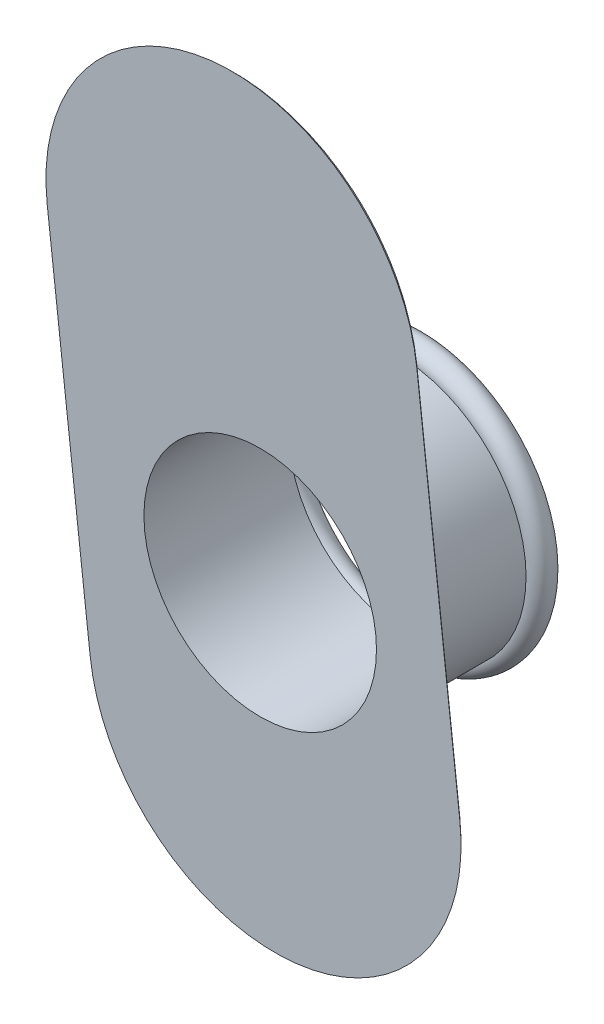
ISO-10303-21;
HEADER;
FILE_DESCRIPTION(('STEP AP214'),'2;1');
FILE_NAME('part.step','',(''),(''),'','','');
FILE_SCHEMA(('AUTOMOTIVE_DESIGN { 1 0 10303 214 1 1 1 1 }'));
ENDSEC;
DATA;
#1=APPLICATION_CONTEXT('core data for automotive mechanical design processes');
#2=APPLICATION_PROTOCOL_DEFINITION('international standard','automotive_design',2000,#1);
#3=PRODUCT_CONTEXT('',#1,'mechanical');
#4=PRODUCT('Part','Part','',(#3));
#5=PRODUCT_RELATED_PRODUCT_CATEGORY('part','',(#4));
#6=PRODUCT_DEFINITION_FORMATION('','',#4);
#7=PRODUCT_DEFINITION_CONTEXT('part definition',#1,'design');
#8=PRODUCT_DEFINITION('design','',#6,#7);
#9=PRODUCT_DEFINITION_SHAPE('','',#8);
#10=(LENGTH_UNIT() NAMED_UNIT(*) SI_UNIT(.MILLI.,.METRE.));
#11=(NAMED_UNIT(*) PLANE_ANGLE_UNIT() SI_UNIT($,.RADIAN.));
#12=(NAMED_UNIT(*) SI_UNIT($,.STERADIAN.) SOLID_ANGLE_UNIT());
#13=UNCERTAINTY_MEASURE_WITH_UNIT(LENGTH_MEASURE(1.E-05),#10,'distance_accuracy_value','');
#14=(GEOMETRIC_REPRESENTATION_CONTEXT(3) GLOBAL_UNCERTAINTY_ASSIGNED_CONTEXT((#13)) GLOBAL_UNIT_ASSIGNED_CONTEXT((#10,
#11,#12)) REPRESENTATION_CONTEXT('',''));
#15=CARTESIAN_POINT('',(0.,0.,0.));
#16=DIRECTION('',(0.,0.,1.));
#17=DIRECTION('',(1.,0.,0.));
#18=AXIS2_PLACEMENT_3D('',#15,#16,#17);
#19=CARTESIAN_POINT('',(550.233603989508,25.6899886030883,218.190394221551));
#20=DIRECTION('',(0.,0.,-1.));
#21=DIRECTION('',(0.993314481568456,0.115439770904089,0.));
#22=AXIS2_PLACEMENT_3D('',#19,#20,#21);
#23=PLANE('',#22);
#24=DIRECTION('',(0.115439770904089,-0.993314481568456,0.));
#25=VECTOR('',#24,1.);
#26=CARTESIAN_POINT('',(532.867618319303,55.887146853862,218.190394221551));
#27=LINE('',#26,#25);
#28=CARTESIAN_POINT('',(536.561690988234,24.1010834436714,218.190394221551));
#29=VERTEX_POINT('',#28);
#30=CARTESIAN_POINT('',(535.58739229226,32.4845460623654,218.190394221551));
#31=VERTEX_POINT('',#30);
#32=EDGE_CURVE('E137',#29,#31,#27,.F.);
#33=ORIENTED_EDGE('',*,*,#32,.T.);
#34=CARTESIAN_POINT('',(548.963766509563,36.6164479003413,218.190394221551));
#35=DIRECTION('',(0.,0.,-1.));
#36=DIRECTION('',(0.993314481568456,0.115439770904089,0.));
#37=AXIS2_PLACEMENT_3D('',#34,#35,#36);
#38=CIRCLE('',#37,14.);
#39=CARTESIAN_POINT('',(562.931218294806,35.6623563811991,218.190394221551));
#40=VERTEX_POINT('',#39);
#41=EDGE_CURVE('E61',#31,#40,#38,.F.);
#42=ORIENTED_EDGE('',*,*,#41,.T.);
#43=DIRECTION('',(-0.115439770904089,0.993314481568456,0.));
#44=VECTOR('',#43,1.);
#45=CARTESIAN_POINT('',(563.905516990781,27.2788937625052,218.190394221551));
#46=LINE('',#45,#44);
#47=CARTESIAN_POINT('',(563.905516990781,27.2788937625052,218.190394221551));
#48=VERTEX_POINT('',#47);
#49=EDGE_CURVE('E255',#40,#48,#46,.F.);
#50=ORIENTED_EDGE('',*,*,#49,.T.);
#51=CARTESIAN_POINT('',(550.233603989508,25.6899886030883,218.190394221551));
#52=DIRECTION('',(0.,0.,-1.));
#53=DIRECTION('',(0.993314481568456,0.115439770904089,0.));
#54=AXIS2_PLACEMENT_3D('',#51,#52,#53);
#55=CIRCLE('',#54,13.7639320225002);
#56=EDGE_CURVE('E254',#48,#29,#55,.T.);
#57=ORIENTED_EDGE('',*,*,#56,.T.);
#58=EDGE_LOOP('',(#33,#42,#50,#57));
#59=FACE_BOUND('',#58,.T.);
#60=ADVANCED_FACE('F40',(#59),#23,.T.);
#61=CARTESIAN_POINT('',(548.963766509563,36.6164479003413,218.190394221551));
#62=DIRECTION('',(0.,0.,1.));
#63=DIRECTION('',(-0.993314481568456,-0.115439770904089,0.));
#64=AXIS2_PLACEMENT_3D('',#61,#62,#63);
#65=CYLINDRICAL_SURFACE('',#64,10.);
#66=CARTESIAN_POINT('',(548.963766509563,36.6164479003413,219.190394221551));
#67=DIRECTION('',(0.,0.,-1.));
#68=DIRECTION('',(0.993314481568456,0.115439770904089,0.));
#69=AXIS2_PLACEMENT_3D('',#66,#67,#68);
#70=CIRCLE('',#69,10.);
#71=CARTESIAN_POINT('',(558.896911325247,37.7708456093822,219.190394221551));
#72=VERTEX_POINT('',#71);
#73=EDGE_CURVE('E133',#72,#72,#70,.T.);
#74=ORIENTED_EDGE('',*,*,#73,.F.);
#75=EDGE_LOOP('',(#74));
#76=FACE_BOUND('',#75,.T.);
#77=CARTESIAN_POINT('',(548.963766509563,36.6164479003413,206.732053398673));
#78=DIRECTION('',(0.,0.,-1.));
#79=DIRECTION('',(0.993314481568456,0.115439770904089,0.));
#80=AXIS2_PLACEMENT_3D('',#77,#78,#79);
#81=CIRCLE('',#80,10.);
#82=CARTESIAN_POINT('',(558.896911325247,37.7708456093822,206.732053398673));
#83=VERTEX_POINT('',#82);
#84=EDGE_CURVE('E138',#83,#83,#81,.T.);
#85=ORIENTED_EDGE('',*,*,#84,.T.);
#86=EDGE_LOOP('',(#85));
#87=FACE_BOUND('',#86,.T.);
#88=ADVANCED_FACE('F232',(#76,#87),#65,.F.);
#89=CARTESIAN_POINT('',(548.963766509563,36.6164479003413,206.190394221551));
#90=DIRECTION('',(0.,0.,1.));
#91=DIRECTION('',(-0.993314481568456,-0.115439770904089,0.));
#92=AXIS2_PLACEMENT_3D('',#89,#90,#91);
#93=CYLINDRICAL_SURFACE('',#92,11.);
#94=CARTESIAN_POINT('',(548.963766509563,36.6164479003413,215.190394221551));
#95=DIRECTION('',(0.,0.,-1.));
#96=DIRECTION('',(0.993314481568456,0.115439770904089,0.));
#97=AXIS2_PLACEMENT_3D('',#94,#95,#96);
#98=CIRCLE('',#97,11.);
#99=CARTESIAN_POINT('',(559.938192912254,35.8668045638724,215.190394221551));
#100=VERTEX_POINT('',#99);
#101=CARTESIAN_POINT('',(538.453758195967,33.3699535990745,215.190394221551));
#102=VERTEX_POINT('',#101);
#103=EDGE_CURVE('E146',#100,#102,#98,.T.);
#104=ORIENTED_EDGE('',*,*,#103,.T.);
#105=CARTESIAN_POINT('',(540.04342914329,30.1800217746185,215.391664177276));
#106=CARTESIAN_POINT('',(539.760051728266,30.572758690203,219.12908927664));
#107=CARTESIAN_POINT('',(536.845253177701,28.3356855724546,218.291029199413));
#108=CARTESIAN_POINT('',(539.95658067049,30.300379027302,215.36719947851));
#109=CARTESIAN_POINT('',(539.706971288824,30.6573693435221,219.064412279108));
#110=CARTESIAN_POINT('',(536.78046692411,28.4941842332649,218.278796849797));
#111=CARTESIAN_POINT('',(539.872011747135,30.4227263679187,215.345897676948));
#112=CARTESIAN_POINT('',(539.651258823226,30.7476072844706,219.002700311881));
#113=CARTESIAN_POINT('',(536.71700540641,28.6550325164166,218.268145949106));
#114=CARTESIAN_POINT('',(539.707707607653,30.6710700530625,215.308675936041));
#115=CARTESIAN_POINT('',(539.537300067266,30.9372911880108,218.886431613447));
#116=CARTESIAN_POINT('',(536.592933088401,28.9809896061933,218.249535078977));
#117=CARTESIAN_POINT('',(539.627971030477,30.7970653552125,215.292754475464));
#118=CARTESIAN_POINT('',(539.479048488402,31.0366751673318,218.83173132647));
#119=CARTESIAN_POINT('',(536.532321486489,29.1460971943129,218.241574348924));
#120=CARTESIAN_POINT('',(539.396571354458,31.179763970179,215.251667203368));
#121=CARTESIAN_POINT('',(539.304386686291,31.3453047461794,218.679358539395));
#122=CARTESIAN_POINT('',(536.355179059829,29.64680808191,218.221030713054));
#123=CARTESIAN_POINT('',(539.252467537794,31.4415272718515,215.233113730465));
#124=CARTESIAN_POINT('',(539.185402012433,31.5691710283717,218.590462996518));
#125=CARTESIAN_POINT('',(536.243153563231,29.9882568517755,218.211753976019));
#126=CARTESIAN_POINT('',(538.986080152425,31.9758778805373,215.207280095995));
#127=CARTESIAN_POINT('',(538.955672407188,32.0436114571011,218.43841970911));
#128=CARTESIAN_POINT('',(536.032383392871,30.6832463708016,218.198837158762));
#129=CARTESIAN_POINT('',(538.863778049485,32.2484557504125,215.199990318029));
#130=CARTESIAN_POINT('',(538.844282963351,32.2945672027593,218.374404721179));
#131=CARTESIAN_POINT('',(535.933627456052,31.0367765415435,218.195192270339));
#132=CARTESIAN_POINT('',(538.641688338013,32.8028024082058,215.191548724722));
#133=CARTESIAN_POINT('',(538.637063913993,32.8168539064131,218.267868251162));
#134=CARTESIAN_POINT('',(535.749963253679,31.7538135776285,218.19097147378));
#135=CARTESIAN_POINT('',(538.5419097344,33.0845748207646,215.190399360177));
#136=CARTESIAN_POINT('',(538.540519339762,33.0890474607261,218.224766463698));
#137=CARTESIAN_POINT('',(535.665060530401,32.1173243683185,218.190396791042));
#138=CARTESIAN_POINT('',(538.354256996814,33.6920753811775,215.190388421319));
#139=CARTESIAN_POINT('',(538.357006083178,33.6832074497276,218.152063848027));
#140=CARTESIAN_POINT('',(535.499724136165,32.8990481750095,218.190391321235));
#141=CARTESIAN_POINT('',(538.269569613606,34.018791963227,215.191840456912));
#142=CARTESIAN_POINT('',(538.271848452934,34.0091630852108,218.124364561907));
#143=CARTESIAN_POINT('',(535.421273295844,33.3182782769156,218.191117339198));
#144=CARTESIAN_POINT('',(538.130554905365,34.6786123241293,215.194166259699));
#145=CARTESIAN_POINT('',(538.131979581218,34.6706703407731,218.088071117173));
#146=CARTESIAN_POINT('',(535.283483040414,34.162598084396,218.192280240692));
#147=CARTESIAN_POINT('',(538.076227539152,35.0117160943179,215.195040027677));
#148=CARTESIAN_POINT('',(538.076628879413,35.0082627169389,218.079239277351));
#149=CARTESIAN_POINT('',(535.224143599382,34.5876877820218,218.192717124614));
#150=CARTESIAN_POINT('',(537.998386885468,35.6815047464747,215.195040027677));
#151=CARTESIAN_POINT('',(537.997985545206,35.6849581238538,218.079239277352));
#152=CARTESIAN_POINT('',(535.125073676512,35.4401460665867,218.192717124614));
#153=CARTESIAN_POINT('',(537.974873597997,36.0181896284428,215.194166259699));
#154=CARTESIAN_POINT('',(537.974438919784,36.0262466660974,218.088071117173));
#155=CARTESIAN_POINT('',(535.085343194672,35.8675146535258,218.192280240692));
#156=CARTESIAN_POINT('',(537.95886263425,36.6923050835456,215.191840456912));
#157=CARTESIAN_POINT('',(537.958872488105,36.7021999460226,218.124364561907));
#158=CARTESIAN_POINT('',(535.025828049392,36.7209313391359,218.191117339198));
#159=CARTESIAN_POINT('',(537.966365000043,37.0297356576912,215.190388421319));
#160=CARTESIAN_POINT('',(537.967007080026,37.0389976994389,218.152063848027));
#161=CARTESIAN_POINT('',(535.006043413005,37.146979436015,218.190391321235));
#162=CARTESIAN_POINT('',(538.009694545107,37.6640802260056,215.190399360177));
#163=CARTESIAN_POINT('',(538.009366945539,37.659407926358,218.224766463698));
#164=CARTESIAN_POINT('',(534.987695744027,37.9457857931813,218.190396791042));
#165=CARTESIAN_POINT('',(538.042193225528,37.9612254732991,215.191548724722));
#166=CARTESIAN_POINT('',(538.040914569094,37.946487938325,218.267868251162));
#167=CARTESIAN_POINT('',(534.986969474148,38.3190792968753,218.19097147378));
#168=CARTESIAN_POINT('',(538.13123200979,38.5517304706069,215.199990318029));
#169=CARTESIAN_POINT('',(538.122831535659,38.502377087184,218.374404721179));
#170=CARTESIAN_POINT('',(535.001296132808,39.0591261853916,218.195192270339));
#171=CARTESIAN_POINT('',(538.187762517457,38.8450916835036,215.207280095995));
#172=CARTESIAN_POINT('',(538.173698967164,38.7721897979471,218.43841970911));
#173=CARTESIAN_POINT('',(535.016342766564,39.4258821198963,218.198837158762));
#174=CARTESIAN_POINT('',(538.324504137591,39.4262926310333,215.233113730465));
#175=CARTESIAN_POINT('',(538.288499395884,39.2866703840772,218.590462996518));
#176=CARTESIAN_POINT('',(535.062109235684,40.1506854908693,218.211753976019));
#177=CARTESIAN_POINT('',(538.404735454582,39.7141274306206,215.251667203368));
#178=CARTESIAN_POINT('',(538.35297221315,39.5318574978278,218.679358539395));
#179=CARTESIAN_POINT('',(535.092842459929,40.5087252138865,218.221030713054));
#180=CARTESIAN_POINT('',(538.542201142113,40.1396943756606,215.292754475464));
#181=CARTESIAN_POINT('',(538.452198939153,39.8723175085532,218.83173132647));
#182=CARTESIAN_POINT('',(535.150432537626,41.0367159479266,218.241574348924));
#183=CARTESIAN_POINT('',(538.590917268048,40.2806180322184,215.308675936041));
#184=CARTESIAN_POINT('',(538.48610563372,39.9824118219821,218.886431613447));
#185=CARTESIAN_POINT('',(535.171563565252,41.2113233979751,218.249535078977));
#186=CARTESIAN_POINT('',(538.693888116162,40.5600235451206,215.345897676948));
#187=CARTESIAN_POINT('',(538.553525737007,40.1931749852601,219.002700311881));
#188=CARTESIAN_POINT('',(535.217575330641,41.5570471054606,218.268145949106));
#189=CARTESIAN_POINT('',(538.748144402171,40.6985046990079,215.36719947851));
#190=CARTESIAN_POINT('',(538.587058508272,40.2937847167029,219.064412279108));
#191=CARTESIAN_POINT('',(535.242457128089,41.7281623607051,218.278796849797));
#192=CARTESIAN_POINT('',(538.805075880311,40.835571588876,215.391664177276));
#193=CARTESIAN_POINT('',(538.619319943527,40.3883135244899,219.12908927664));
#194=CARTESIAN_POINT('',(535.269167206636,41.8972944269642,218.291029199413));
#195=(BOUNDED_SURFACE() B_SPLINE_SURFACE(3,2,((#105,#106,#107),(#108,#109,#110),(#111,#112,
#113),(#114,#115,#116),(#117,#118,#119),(#120,#121,#122),(#123,#124,#125),(#126,#127,#128),
(#129,#130,#131),(#132,#133,#134),(#135,#136,#137),(#138,#139,#140),(#141,#142,#143),(#144,#145,
#146),(#147,#148,#149),(#150,#151,#152),(#153,#154,#155),(#156,#157,#158),(#159,#160,#161),
(#162,#163,#164),(#165,#166,#167),(#168,#169,#170),(#171,#172,#173),(#174,#175,#176),(#177,#178,
#179),(#180,#181,#182),(#183,#184,#185),(#186,#187,#188),(#189,#190,#191),(#192,#193,#194)),
.UNSPECIFIED.,.F.,.F.,.F.) B_SPLINE_SURFACE_WITH_KNOTS((4,2,2,2,2,2,2,2,2,2,2,2,2,2,4),(3,3),
(0.,0.571273603242985,1.14238554983954,2.28296922852472,3.42257859279195,4.56264277028438,
5.84949215250036,7.13633978925784,8.42318742601531,9.71003680823128,10.8501009857237,
11.9897103499909,13.1302940286761,13.7014059752726,14.2726795785157),(0.,1.),
.UNSPECIFIED.) GEOMETRIC_REPRESENTATION_ITEM() RATIONAL_B_SPLINE_SURFACE(((1.,0.622802290166438,
1.),(1.,0.627504801588546,1.),(1.,0.632112426602754,1.),(1.,0.641090187858932,1.),(1.,
0.645460390935537,1.),(1.,0.658135118551086,1.),(1.,0.666017528344806,1.),(1.,0.680369299730215,
1.),(1.,0.68683986263038,1.),(1.,0.698195419001859,1.),(1.,0.70307977864858,1.),(1.,
0.711652267160473,1.),(1.,0.715105411239732,1.),(1.,0.719720787123328,1.),(1.,0.720883022035008,
1.),(1.,0.720883022035002,1.),(1.,0.719720787123314,1.),(1.,0.71510541123972,1.),(1.,
0.71165226716047,1.),(1.,0.703079778648582,1.),(1.,0.69819541900186,1.),(1.,0.686839862630378,
1.),(1.,0.680369299730213,1.),(1.,0.666017528344809,1.),(1.,0.658135118551094,1.),(1.,
0.645460390935534,1.),(1.,0.641090187858922,1.),(1.,0.632112426602739,1.),(1.,0.627504801588533,
1.),(1.,0.622802290166439,1.))) REPRESENTATION_ITEM('') SURFACE());
#196=CARTESIAN_POINT('',(540.04342914329,30.1800217746185,215.391664177276));
#197=CARTESIAN_POINT('',(539.95658067049,30.300379027302,215.36719947851));
#198=CARTESIAN_POINT('',(539.872011747135,30.4227263679187,215.345897676948));
#199=CARTESIAN_POINT('',(539.707707607653,30.6710700530625,215.308675936041));
#200=CARTESIAN_POINT('',(539.627971030477,30.7970653552125,215.292754475464));
#201=CARTESIAN_POINT('',(539.396571354458,31.179763970179,215.251667203368));
#202=CARTESIAN_POINT('',(539.252467537794,31.4415272718515,215.233113730465));
#203=CARTESIAN_POINT('',(538.986080152425,31.9758778805373,215.207280095995));
#204=CARTESIAN_POINT('',(538.863778049485,32.2484557504125,215.199990318029));
#205=CARTESIAN_POINT('',(538.641688338013,32.8028024082058,215.191548724722));
#206=CARTESIAN_POINT('',(538.541909734399,33.0845748207646,215.190399360177));
#207=CARTESIAN_POINT('',(538.354256996814,33.6920753811775,215.190388421319));
#208=CARTESIAN_POINT('',(538.269569613606,34.018791963227,215.191840456912));
#209=CARTESIAN_POINT('',(538.130554905365,34.6786123241293,215.194166259699));
#210=CARTESIAN_POINT('',(538.076227539152,35.0117160943179,215.195040027677));
#211=CARTESIAN_POINT('',(537.998386885468,35.6815047464747,215.195040027677));
#212=CARTESIAN_POINT('',(537.974873597997,36.0181896284428,215.194166259699));
#213=CARTESIAN_POINT('',(537.95886263425,36.6923050835456,215.191840456912));
#214=CARTESIAN_POINT('',(537.966365000043,37.0297356576912,215.190388421319));
#215=CARTESIAN_POINT('',(538.009694545107,37.6640802260056,215.190399360177));
#216=CARTESIAN_POINT('',(538.042193225528,37.9612254732991,215.191548724722));
#217=CARTESIAN_POINT('',(538.13123200979,38.5517304706069,215.199990318029));
#218=CARTESIAN_POINT('',(538.187762517457,38.8450916835036,215.207280095995));
#219=CARTESIAN_POINT('',(538.324504137591,39.4262926310333,215.233113730465));
#220=CARTESIAN_POINT('',(538.404735454582,39.7141274306206,215.251667203368));
#221=CARTESIAN_POINT('',(538.542201142113,40.1396943756606,215.292754475464));
#222=CARTESIAN_POINT('',(538.590917268048,40.2806180322184,215.308675936041));
#223=CARTESIAN_POINT('',(538.693888116162,40.5600235451206,215.345897676948));
#224=CARTESIAN_POINT('',(538.748144402171,40.6985046990079,215.36719947851));
#225=CARTESIAN_POINT('',(538.805075880311,40.835571588876,215.391664177276));
#226=B_SPLINE_CURVE_WITH_KNOTS('',3,(#196,#197,#198,#199,#200,#201,#202,#203,#204,#205,#206,
#207,#208,#209,#210,#211,#212,#213,#214,#215,#216,#217,#218,#219,#220,#221,#222,#223,#224,#225),
.UNSPECIFIED.,.F.,.F.,(4,2,2,2,2,2,2,2,2,2,2,2,2,2,4),(0.,0.571273603242985,1.14238554983954,
2.28296922852472,3.42257859279195,4.56264277028438,5.84949215250036,7.13633978925784,
8.42318742601531,9.71003680823128,10.8501009857237,11.9897103499909,13.1302940286761,
13.7014059752726,14.2726795785157),.UNSPECIFIED.);
#227=CARTESIAN_POINT('',(537.989340106871,37.3660912368102,215.190394221551));
#228=VERTEX_POINT('',#227);
#229=EDGE_CURVE('E264',#102,#228,#226,.T.);
#230=ORIENTED_EDGE('',*,*,#229,.T.);
#231=CARTESIAN_POINT('',(548.963766509563,36.6164479003413,215.190394221551));
#232=DIRECTION('',(0.,0.,-1.));
#233=DIRECTION('',(0.993314481568456,0.115439770904089,0.));
#234=AXIS2_PLACEMENT_3D('',#231,#232,#233);
#235=CIRCLE('',#234,11.);
#236=CARTESIAN_POINT('',(559.473774823158,39.8629422016081,215.190394221551));
#237=VERTEX_POINT('',#236);
#238=EDGE_CURVE('E157',#228,#237,#235,.T.);
#239=ORIENTED_EDGE('',*,*,#238,.T.);
#240=CARTESIAN_POINT('',(557.884103875835,43.0528740260641,215.391664177276));
#241=CARTESIAN_POINT('',(558.16748129086,42.6601371104796,219.12908927664));
#242=CARTESIAN_POINT('',(561.082279841425,44.897210228228,218.291029199413));
#243=CARTESIAN_POINT('',(557.970952348636,42.9325167733806,215.36719947851));
#244=CARTESIAN_POINT('',(558.220561730301,42.5755264571605,219.064412279108));
#245=CARTESIAN_POINT('',(561.147066095016,44.7387115674178,218.278796849797));
#246=CARTESIAN_POINT('',(558.055521271991,42.810169432764,215.345897676948));
#247=CARTESIAN_POINT('',(558.276274195899,42.485288516212,219.002700311881));
#248=CARTESIAN_POINT('',(561.210527612716,44.577863284266,218.268145949106));
#249=CARTESIAN_POINT('',(558.219825411472,42.5618257476202,215.308675936041));
#250=CARTESIAN_POINT('',(558.390232951859,42.2956046126718,218.886431613447));
#251=CARTESIAN_POINT('',(561.334599930725,44.2519061944893,218.249535078977));
#252=CARTESIAN_POINT('',(558.299561988649,42.4358304454701,215.292754475464));
#253=CARTESIAN_POINT('',(558.448484530724,42.1962206333508,218.83173132647));
#254=CARTESIAN_POINT('',(561.395211532636,44.0867986063697,218.241574348924));
#255=CARTESIAN_POINT('',(558.530961664668,42.0531318305037,215.251667203368));
#256=CARTESIAN_POINT('',(558.623146332835,41.8875910545031,218.679358539395));
#257=CARTESIAN_POINT('',(561.572353959296,43.5860877187726,218.221030713054));
#258=CARTESIAN_POINT('',(558.675065481332,41.7913685288311,215.233113730465));
#259=CARTESIAN_POINT('',(558.742131006692,41.6637247723109,218.590462996518));
#260=CARTESIAN_POINT('',(561.684379455895,43.2446389489072,218.211753976019));
#261=CARTESIAN_POINT('',(558.9414528667,41.2570179201453,215.207280095995));
#262=CARTESIAN_POINT('',(558.971860611937,41.1892843435815,218.43841970911));
#263=CARTESIAN_POINT('',(561.895149626254,42.549649429881,218.198837158762));
#264=CARTESIAN_POINT('',(559.063754969641,40.9844400502701,215.199990318029));
#265=CARTESIAN_POINT('',(559.083250055775,40.9383285979233,218.374404721179));
#266=CARTESIAN_POINT('',(561.993905563073,42.1961192591391,218.195192270339));
#267=CARTESIAN_POINT('',(559.285844681113,40.4300933924768,215.191548724722));
#268=CARTESIAN_POINT('',(559.290469105133,40.4160418942695,218.267868251162));
#269=CARTESIAN_POINT('',(562.177569765446,41.4790822230541,218.19097147378));
#270=CARTESIAN_POINT('',(559.385623284726,40.148320979918,215.190399360177));
#271=CARTESIAN_POINT('',(559.387013679364,40.1438483399565,218.224766463698));
#272=CARTESIAN_POINT('',(562.262472488725,41.1155714323641,218.190396791042));
#273=CARTESIAN_POINT('',(559.573276022312,39.5408204195051,215.190388421319));
#274=CARTESIAN_POINT('',(559.570526935947,39.549688350955,218.152063848027));
#275=CARTESIAN_POINT('',(562.42780888296,40.3338476256731,218.190391321235));
#276=CARTESIAN_POINT('',(559.657963405519,39.2141038374556,215.191840456912));
#277=CARTESIAN_POINT('',(559.655684566191,39.2237327154718,218.124364561907));
#278=CARTESIAN_POINT('',(562.506259723281,39.9146175237671,218.191117339198));
#279=CARTESIAN_POINT('',(559.796978113761,38.5542834765534,215.194166259699));
#280=CARTESIAN_POINT('',(559.795553437907,38.5622254599095,218.088071117173));
#281=CARTESIAN_POINT('',(562.644049978712,39.0702977162866,218.192280240692));
#282=CARTESIAN_POINT('',(559.851305479974,38.2211797063647,215.195040027677));
#283=CARTESIAN_POINT('',(559.850904139712,38.2246330837438,218.079239277351));
#284=CARTESIAN_POINT('',(562.703389419743,38.6452080186608,218.192717124614));
#285=CARTESIAN_POINT('',(559.929146133658,37.5513910542079,215.195040027677));
#286=CARTESIAN_POINT('',(559.929547473919,37.5479376768288,218.079239277351));
#287=CARTESIAN_POINT('',(562.802459342614,37.7927497340959,218.192717124614));
#288=CARTESIAN_POINT('',(559.952659421129,37.2147061722398,215.194166259699));
#289=CARTESIAN_POINT('',(559.953094099341,37.2066491345852,218.088071117173));
#290=CARTESIAN_POINT('',(562.842189824453,37.3653811471569,218.192280240692));
#291=CARTESIAN_POINT('',(559.968670384875,36.540590717137,215.191840456912));
#292=CARTESIAN_POINT('',(559.968660531021,36.5306958546601,218.124364561907));
#293=CARTESIAN_POINT('',(562.901704969734,36.5119644615468,218.191117339198));
#294=CARTESIAN_POINT('',(559.961168019082,36.2031601429915,215.190388421319));
#295=CARTESIAN_POINT('',(559.9605259391,36.1938981012438,218.152063848027));
#296=CARTESIAN_POINT('',(562.921489606121,36.0859163646676,218.190391321235));
#297=CARTESIAN_POINT('',(559.917838474018,35.568815574677,215.190399360177));
#298=CARTESIAN_POINT('',(559.918166073587,35.5734878743246,218.224766463698));
#299=CARTESIAN_POINT('',(562.939837275098,35.2871100075014,218.190396791042));
#300=CARTESIAN_POINT('',(559.885339793598,35.2716703273836,215.191548724722));
#301=CARTESIAN_POINT('',(559.886618450032,35.2864078623576,218.267868251162));
#302=CARTESIAN_POINT('',(562.940563544977,34.9138165038074,218.19097147378));
#303=CARTESIAN_POINT('',(559.796301009336,34.6811653300758,215.199990318029));
#304=CARTESIAN_POINT('',(559.804701483466,34.7305187134987,218.374404721179));
#305=CARTESIAN_POINT('',(562.926236886317,34.1737696152911,218.195192270339));
#306=CARTESIAN_POINT('',(559.739770501669,34.3878041171791,215.207280095995));
#307=CARTESIAN_POINT('',(559.753834051961,34.4607060027356,218.43841970911));
#308=CARTESIAN_POINT('',(562.911190252562,33.8070136807864,218.198837158762));
#309=CARTESIAN_POINT('',(559.603028881535,33.8066031696494,215.233113730465));
#310=CARTESIAN_POINT('',(559.639033623242,33.9462254166055,218.590462996518));
#311=CARTESIAN_POINT('',(562.865423783441,33.0822103098134,218.211753976019));
#312=CARTESIAN_POINT('',(559.522797564543,33.518768370062,215.251667203368));
#313=CARTESIAN_POINT('',(559.574560805975,33.7010383028549,218.679358539395));
#314=CARTESIAN_POINT('',(562.834690559196,32.7241705867961,218.221030713054));
#315=CARTESIAN_POINT('',(559.385331877012,33.0932014250221,215.292754475464));
#316=CARTESIAN_POINT('',(559.475334079973,33.3605782921295,218.83173132647));
#317=CARTESIAN_POINT('',(562.777100481499,32.196179852756,218.241574348924));
#318=CARTESIAN_POINT('',(559.336615751077,32.9522777684642,215.308675936041));
#319=CARTESIAN_POINT('',(559.441427385405,33.2504839787005,218.886431613447));
#320=CARTESIAN_POINT('',(562.755969453873,32.0215724027076,218.249535078977));
#321=CARTESIAN_POINT('',(559.233644902963,32.672872255562,215.345897676948));
#322=CARTESIAN_POINT('',(559.374007282118,33.0397208154225,219.002700311881));
#323=CARTESIAN_POINT('',(562.709957688485,31.675848695222,218.268145949106));
#324=CARTESIAN_POINT('',(559.179388616954,32.5343911016747,215.36719947851));
#325=CARTESIAN_POINT('',(559.340474510854,32.9391110839797,219.064412279108));
#326=CARTESIAN_POINT('',(562.685075891036,31.5047334399775,218.278796849797));
#327=CARTESIAN_POINT('',(559.122457138814,32.3973242118066,215.391664177276));
#328=CARTESIAN_POINT('',(559.308213075599,32.8445822761927,219.12908927664));
#329=CARTESIAN_POINT('',(562.658365812489,31.3356013737184,218.291029199413));
#330=(BOUNDED_SURFACE() B_SPLINE_SURFACE(3,2,((#240,#241,#242),(#243,#244,#245),(#246,#247,
#248),(#249,#250,#251),(#252,#253,#254),(#255,#256,#257),(#258,#259,#260),(#261,#262,#263),
(#264,#265,#266),(#267,#268,#269),(#270,#271,#272),(#273,#274,#275),(#276,#277,#278),(#279,#280,
#281),(#282,#283,#284),(#285,#286,#287),(#288,#289,#290),(#291,#292,#293),(#294,#295,#296),
(#297,#298,#299),(#300,#301,#302),(#303,#304,#305),(#306,#307,#308),(#309,#310,#311),(#312,#313,
#314),(#315,#316,#317),(#318,#319,#320),(#321,#322,#323),(#324,#325,#326),(#327,#328,#329)),
.UNSPECIFIED.,.F.,.F.,.F.) B_SPLINE_SURFACE_WITH_KNOTS((4,2,2,2,2,2,2,2,2,2,2,2,2,2,4),(3,3),
(0.,0.571273603242988,1.14238554983954,2.28296922852472,3.42257859279195,4.56264277028438,
5.84949215250034,7.13633978925782,8.42318742601531,9.71003680823128,10.8501009857237,
11.9897103499909,13.1302940286761,13.7014059752727,14.2726795785157),(0.,1.),
.UNSPECIFIED.) GEOMETRIC_REPRESENTATION_ITEM() RATIONAL_B_SPLINE_SURFACE(((1.,0.622802290166438,
1.),(1.,0.627504801588539,1.),(1.,0.632112426602744,1.),(1.,0.64109018785892,1.),(1.,
0.645460390935525,1.),(1.,0.658135118551074,1.),(1.,0.666017528344791,1.),(1.,0.680369299730205,
1.),(1.,0.686839862630376,1.),(1.,0.698195419001862,1.),(1.,0.703079778648583,1.),(1.,
0.711652267160469,1.),(1.,0.715105411239719,1.),(1.,0.719720787123315,1.),(1.,0.720883022035005,
1.),(1.,0.720883022035005,1.),(1.,0.719720787123315,1.),(1.,0.715105411239719,1.),(1.,
0.711652267160469,1.),(1.,0.703079778648583,1.),(1.,0.698195419001863,1.),(1.,0.686839862630376,
1.),(1.,0.680369299730204,1.),(1.,0.666017528344791,1.),(1.,0.658135118551074,1.),(1.,
0.645460390935525,1.),(1.,0.641090187858919,1.),(1.,0.632112426602743,1.),(1.,0.627504801588538,
1.),(1.,0.622802290166439,1.))) REPRESENTATION_ITEM('') SURFACE());
#331=CARTESIAN_POINT('',(557.884103875835,43.0528740260641,215.391664177276));
#332=CARTESIAN_POINT('',(557.970952348636,42.9325167733806,215.36719947851));
#333=CARTESIAN_POINT('',(558.055521271991,42.8101694327639,215.345897676948));
#334=CARTESIAN_POINT('',(558.219825411472,42.5618257476202,215.308675936041));
#335=CARTESIAN_POINT('',(558.299561988649,42.4358304454701,215.292754475464));
#336=CARTESIAN_POINT('',(558.530961664668,42.0531318305037,215.251667203368));
#337=CARTESIAN_POINT('',(558.675065481332,41.7913685288311,215.233113730465));
#338=CARTESIAN_POINT('',(558.941452866701,41.2570179201453,215.207280095995));
#339=CARTESIAN_POINT('',(559.063754969641,40.9844400502701,215.199990318029));
#340=CARTESIAN_POINT('',(559.285844681113,40.4300933924768,215.191548724722));
#341=CARTESIAN_POINT('',(559.385623284726,40.148320979918,215.190399360177));
#342=CARTESIAN_POINT('',(559.573276022312,39.5408204195051,215.190388421319));
#343=CARTESIAN_POINT('',(559.657963405519,39.2141038374556,215.191840456912));
#344=CARTESIAN_POINT('',(559.79697811376,38.5542834765533,215.194166259699));
#345=CARTESIAN_POINT('',(559.851305479974,38.2211797063647,215.195040027677));
#346=CARTESIAN_POINT('',(559.929146133658,37.5513910542079,215.195040027677));
#347=CARTESIAN_POINT('',(559.952659421129,37.2147061722398,215.194166259699));
#348=CARTESIAN_POINT('',(559.968670384875,36.540590717137,215.191840456912));
#349=CARTESIAN_POINT('',(559.961168019082,36.2031601429915,215.190388421319));
#350=CARTESIAN_POINT('',(559.917838474018,35.568815574677,215.190399360177));
#351=CARTESIAN_POINT('',(559.885339793598,35.2716703273836,215.191548724722));
#352=CARTESIAN_POINT('',(559.796301009336,34.6811653300758,215.199990318029));
#353=CARTESIAN_POINT('',(559.739770501669,34.3878041171791,215.207280095995));
#354=CARTESIAN_POINT('',(559.603028881535,33.8066031696494,215.233113730465));
#355=CARTESIAN_POINT('',(559.522797564543,33.518768370062,215.251667203368));
#356=CARTESIAN_POINT('',(559.385331877012,33.0932014250221,215.292754475464));
#357=CARTESIAN_POINT('',(559.336615751077,32.9522777684642,215.308675936041));
#358=CARTESIAN_POINT('',(559.233644902963,32.672872255562,215.345897676948));
#359=CARTESIAN_POINT('',(559.179388616954,32.5343911016747,215.36719947851));
#360=CARTESIAN_POINT('',(559.122457138814,32.3973242118066,215.391664177276));
#361=B_SPLINE_CURVE_WITH_KNOTS('',3,(#331,#332,#333,#334,#335,#336,#337,#338,#339,#340,#341,
#342,#343,#344,#345,#346,#347,#348,#349,#350,#351,#352,#353,#354,#355,#356,#357,#358,#359,#360),
.UNSPECIFIED.,.F.,.F.,(4,2,2,2,2,2,2,2,2,2,2,2,2,2,4),(0.,0.571273603242988,1.14238554983954,
2.28296922852472,3.42257859279195,4.56264277028438,5.84949215250034,7.13633978925782,
8.42318742601531,9.71003680823128,10.8501009857237,11.9897103499909,13.1302940286761,
13.7014059752727,14.2726795785157),.UNSPECIFIED.);
#362=EDGE_CURVE('E148',#237,#100,#361,.T.);
#363=ORIENTED_EDGE('',*,*,#362,.T.);
#364=EDGE_LOOP('',(#104,#230,#239,#363));
#365=FACE_BOUND('',#364,.T.);
#366=CARTESIAN_POINT('',(548.963766509563,36.6164479003413,207.327669326423));
#367=DIRECTION('',(0.,0.,-1.));
#368=DIRECTION('',(0.993314481568456,0.115439770904089,0.));
#369=AXIS2_PLACEMENT_3D('',#366,#367,#368);
#370=CIRCLE('',#369,11.);
#371=CARTESIAN_POINT('',(559.890225806816,37.8862853802863,207.327669326423));
#372=VERTEX_POINT('',#371);
#373=EDGE_CURVE('E283',#372,#372,#370,.T.);
#374=ORIENTED_EDGE('',*,*,#373,.F.);
#375=EDGE_LOOP('',(#374));
#376=FACE_BOUND('',#375,.T.);
#377=ADVANCED_FACE('F159',(#365,#376),#93,.T.);
#378=CARTESIAN_POINT('',(560.21144432185,59.0649571726958,218.190394221551));
#379=VERTEX_POINT('',#378);
#380=CARTESIAN_POINT('',(562.340140726866,40.7483497383173,218.190394221551));
#381=VERTEX_POINT('',#380);
#382=EDGE_CURVE('E248',#379,#381,#46,.F.);
#383=ORIENTED_EDGE('',*,*,#382,.T.);
#384=CARTESIAN_POINT('',(548.963766509563,36.6164479003413,218.190394221551));
#385=DIRECTION('',(0.,0.,-1.));
#386=DIRECTION('',(0.993314481568456,0.115439770904089,0.));
#387=AXIS2_PLACEMENT_3D('',#384,#385,#386);
#388=CIRCLE('',#387,14.);
#389=CARTESIAN_POINT('',(534.996314724319,37.5705394194835,218.190394221551));
#390=VERTEX_POINT('',#389);
#391=EDGE_CURVE('E251',#381,#390,#388,.F.);
#392=ORIENTED_EDGE('',*,*,#391,.T.);
#393=CARTESIAN_POINT('',(532.867618319303,55.887146853862,218.190394221551));
#394=VERTEX_POINT('',#393);
#395=EDGE_CURVE('E276',#390,#394,#27,.F.);
#396=ORIENTED_EDGE('',*,*,#395,.T.);
#397=CARTESIAN_POINT('',(546.539531320577,57.4760520132789,218.190394221551));
#398=DIRECTION('',(0.,0.,-1.));
#399=DIRECTION('',(0.993314481568456,0.115439770904089,0.));
#400=AXIS2_PLACEMENT_3D('',#397,#398,#399);
#401=CIRCLE('',#400,13.7639320225002);
#402=EDGE_CURVE('E149',#394,#379,#401,.T.);
#403=ORIENTED_EDGE('',*,*,#402,.T.);
#404=EDGE_LOOP('',(#383,#392,#396,#403));
#405=FACE_BOUND('',#404,.T.);
#406=ADVANCED_FACE('F234',(#405),#23,.T.);
#407=CARTESIAN_POINT('',(550.233603989508,25.6899886030883,219.190394221551));
#408=DIRECTION('',(0.,0.,-1.));
#409=DIRECTION('',(0.993314481568456,0.115439770904089,0.));
#410=AXIS2_PLACEMENT_3D('',#407,#408,#409);
#411=PLANE('',#410);
#412=CARTESIAN_POINT('',(550.233603989508,25.6899886030883,219.190394221551));
#413=DIRECTION('',(0.,0.,-1.));
#414=DIRECTION('',(0.993314481568456,0.115439770904089,0.));
#415=AXIS2_PLACEMENT_3D('',#412,#413,#414);
#416=CIRCLE('',#415,16.);
#417=CARTESIAN_POINT('',(566.126635694603,27.5370249375537,219.190394221551));
#418=VERTEX_POINT('',#417);
#419=CARTESIAN_POINT('',(534.340572284412,23.8429522686228,219.190394221551));
#420=VERTEX_POINT('',#419);
#421=EDGE_CURVE('E116',#418,#420,#416,.T.);
#422=ORIENTED_EDGE('',*,*,#421,.F.);
#423=DIRECTION('',(0.115439770904089,-0.993314481568456,0.));
#424=VECTOR('',#423,1.);
#425=CARTESIAN_POINT('',(562.432563025672,59.3230883477443,219.190394221551));
#426=LINE('',#425,#424);
#427=CARTESIAN_POINT('',(562.432563025672,59.3230883477443,219.190394221551));
#428=VERTEX_POINT('',#427);
#429=EDGE_CURVE('E282',#428,#418,#426,.T.);
#430=ORIENTED_EDGE('',*,*,#429,.F.);
#431=CARTESIAN_POINT('',(546.539531320577,57.4760520132789,219.190394221551));
#432=DIRECTION('',(0.,0.,-1.));
#433=DIRECTION('',(0.993314481568456,0.115439770904089,0.));
#434=AXIS2_PLACEMENT_3D('',#431,#432,#433);
#435=CIRCLE('',#434,16.);
#436=CARTESIAN_POINT('',(530.646499615482,55.6290156788135,219.190394221551));
#437=VERTEX_POINT('',#436);
#438=EDGE_CURVE('E119',#437,#428,#435,.T.);
#439=ORIENTED_EDGE('',*,*,#438,.F.);
#440=DIRECTION('',(-0.115439770904089,0.993314481568456,0.));
#441=VECTOR('',#440,1.);
#442=CARTESIAN_POINT('',(534.340572284412,23.8429522686228,219.190394221551));
#443=LINE('',#442,#441);
#444=EDGE_CURVE('E112',#420,#437,#443,.T.);
#445=ORIENTED_EDGE('',*,*,#444,.F.);
#446=EDGE_LOOP('',(#422,#430,#439,#445));
#447=FACE_BOUND('',#446,.T.);
#448=ORIENTED_EDGE('',*,*,#73,.T.);
#449=EDGE_LOOP('',(#448));
#450=FACE_BOUND('',#449,.T.);
#451=ADVANCED_FACE('F114',(#447,#450),#411,.F.);
#452=CARTESIAN_POINT('',(548.963766509563,36.6164479003413,206.190394221551));
#453=DIRECTION('',(0.,0.,1.));
#454=DIRECTION('',(-0.993314481568456,-0.115439770904089,0.));
#455=AXIS2_PLACEMENT_3D('',#452,#453,#454);
#456=TOROIDAL_SURFACE('',#455,11.,1.13727510487138);
#457=ORIENTED_EDGE('',*,*,#84,.F.);
#458=EDGE_LOOP('',(#457));
#459=FACE_BOUND('',#458,.T.);
#460=ORIENTED_EDGE('',*,*,#373,.T.);
#461=EDGE_LOOP('',(#460));
#462=FACE_BOUND('',#461,.T.);
#463=ADVANCED_FACE('F244',(#459,#462),#456,.T.);
#464=CARTESIAN_POINT('',(550.233603989508,25.6899886030883,221.190394221551));
#465=DIRECTION('',(0.,0.,1.));
#466=DIRECTION('',(-0.993314481568456,-0.115439770904089,0.));
#467=AXIS2_PLACEMENT_3D('',#464,#465,#466);
#468=TOROIDAL_SURFACE('',#467,13.7639320225002,3.);
#469=CARTESIAN_POINT('',(563.905516990781,27.2788937625052,221.190394221551));
#470=DIRECTION('',(-0.115439770904089,0.993314481568456,0.));
#471=DIRECTION('',(0.993314481568456,0.115439770904089,0.));
#472=AXIS2_PLACEMENT_3D('',#469,#470,#471);
#473=CIRCLE('',#472,3.);
#474=EDGE_CURVE('E131',#418,#48,#473,.T.);
#475=ORIENTED_EDGE('',*,*,#474,.F.);
#476=ORIENTED_EDGE('',*,*,#421,.T.);
#477=CARTESIAN_POINT('',(536.561690988234,24.1010834436714,221.190394221551));
#478=DIRECTION('',(-0.115439770904089,0.993314481568456,0.));
#479=DIRECTION('',(0.993314481568456,0.115439770904089,0.));
#480=AXIS2_PLACEMENT_3D('',#477,#478,#479);
#481=CIRCLE('',#480,3.);
#482=EDGE_CURVE('E128',#29,#420,#481,.T.);
#483=ORIENTED_EDGE('',*,*,#482,.F.);
#484=ORIENTED_EDGE('',*,*,#56,.F.);
#485=EDGE_LOOP('',(#475,#476,#483,#484));
#486=FACE_BOUND('',#485,.T.);
#487=ADVANCED_FACE('F126',(#486),#468,.T.);
#488=CARTESIAN_POINT('',(536.561690988234,24.1010834436714,221.190394221551));
#489=DIRECTION('',(-0.115439770904089,0.993314481568456,0.));
#490=DIRECTION('',(0.993314481568456,0.115439770904089,0.));
#491=AXIS2_PLACEMENT_3D('',#488,#489,#490);
#492=CYLINDRICAL_SURFACE('',#491,3.);
#493=ORIENTED_EDGE('',*,*,#395,.F.);
#494=CARTESIAN_POINT('',(535.269167206636,41.8972944269642,218.291029199413));
#495=CARTESIAN_POINT('',(535.242457128089,41.7281623607051,218.278796849797));
#496=CARTESIAN_POINT('',(535.217575330641,41.5570471054606,218.268145949106));
#497=CARTESIAN_POINT('',(535.171563565252,41.2113233979751,218.249535078977));
#498=CARTESIAN_POINT('',(535.150432537626,41.0367159479266,218.241574348924));
#499=CARTESIAN_POINT('',(535.092842459929,40.5087252138865,218.221030713054));
#500=CARTESIAN_POINT('',(535.062109235684,40.1506854908693,218.211753976019));
#501=CARTESIAN_POINT('',(535.016342766564,39.4258821198963,218.198837158762));
#502=CARTESIAN_POINT('',(535.001296132808,39.0591261853916,218.195192270339));
#503=CARTESIAN_POINT('',(534.986969474148,38.3190792968753,218.19097147378));
#504=CARTESIAN_POINT('',(534.987695744027,37.9457857931813,218.190396791042));
#505=CARTESIAN_POINT('',(535.006043413005,37.146979436015,218.190391321235));
#506=CARTESIAN_POINT('',(535.025828049392,36.7209313391359,218.191117339198));
#507=CARTESIAN_POINT('',(535.085343194672,35.8675146535258,218.192280240692));
#508=CARTESIAN_POINT('',(535.125073676511,35.4401460665867,218.192717124614));
#509=CARTESIAN_POINT('',(535.224143599382,34.5876877820218,218.192717124614));
#510=CARTESIAN_POINT('',(535.283483040414,34.162598084396,218.192280240692));
#511=CARTESIAN_POINT('',(535.421273295844,33.3182782769155,218.191117339198));
#512=CARTESIAN_POINT('',(535.499724136165,32.8990481750095,218.190391321235));
#513=CARTESIAN_POINT('',(535.665060530401,32.1173243683185,218.190396791042));
#514=CARTESIAN_POINT('',(535.749963253679,31.7538135776285,218.19097147378));
#515=CARTESIAN_POINT('',(535.933627456052,31.0367765415435,218.195192270339));
#516=CARTESIAN_POINT('',(536.032383392871,30.6832463708016,218.198837158762));
#517=CARTESIAN_POINT('',(536.243153563231,29.9882568517755,218.211753976019));
#518=CARTESIAN_POINT('',(536.355179059829,29.64680808191,218.221030713054));
#519=CARTESIAN_POINT('',(536.532321486489,29.1460971943129,218.241574348924));
#520=CARTESIAN_POINT('',(536.592933088401,28.9809896061933,218.249535078977));
#521=CARTESIAN_POINT('',(536.71700540641,28.6550325164166,218.268145949106));
#522=CARTESIAN_POINT('',(536.78046692411,28.4941842332649,218.278796849797));
#523=CARTESIAN_POINT('',(536.845253177701,28.3356855724546,218.291029199413));
#524=B_SPLINE_CURVE_WITH_KNOTS('',3,(#494,#495,#496,#497,#498,#499,#500,#501,#502,#503,#504,
#505,#506,#507,#508,#509,#510,#511,#512,#513,#514,#515,#516,#517,#518,#519,#520,#521,#522,#523),
.UNSPECIFIED.,.F.,.F.,(4,2,2,2,2,2,2,2,2,2,2,2,2,2,4),(0.,0.571273603243034,1.14238554983959,
2.28296922852479,3.422578592792,4.5626427702844,5.84949215250037,7.13633978925785,
8.42318742601533,9.7100368082313,10.8501009857237,11.989710349991,13.1302940286761,
13.7014059752727,14.2726795785157),.UNSPECIFIED.);
#525=EDGE_CURVE('E11',#390,#31,#524,.T.);
#526=ORIENTED_EDGE('',*,*,#525,.T.);
#527=ORIENTED_EDGE('',*,*,#32,.F.);
#528=ORIENTED_EDGE('',*,*,#482,.T.);
#529=ORIENTED_EDGE('',*,*,#444,.T.);
#530=CARTESIAN_POINT('',(532.867618319303,55.887146853862,221.190394221551));
#531=DIRECTION('',(-0.115439770904089,0.993314481568456,0.));
#532=DIRECTION('',(0.993314481568456,0.115439770904089,0.));
#533=AXIS2_PLACEMENT_3D('',#530,#531,#532);
#534=CIRCLE('',#533,3.);
#535=EDGE_CURVE('E142',#394,#437,#534,.T.);
#536=ORIENTED_EDGE('',*,*,#535,.F.);
#537=EDGE_LOOP('',(#493,#526,#527,#528,#529,#536));
#538=FACE_BOUND('',#537,.T.);
#539=ADVANCED_FACE('F136',(#538),#492,.T.);
#540=CARTESIAN_POINT('',(560.21144432185,59.0649571726958,221.190394221551));
#541=DIRECTION('',(0.115439770904089,-0.993314481568456,0.));
#542=DIRECTION('',(-0.993314481568456,-0.115439770904089,0.));
#543=AXIS2_PLACEMENT_3D('',#540,#541,#542);
#544=CYLINDRICAL_SURFACE('',#543,3.);
#545=ORIENTED_EDGE('',*,*,#49,.F.);
#546=CARTESIAN_POINT('',(562.658365812489,31.3356013737184,218.291029199413));
#547=CARTESIAN_POINT('',(562.685075891037,31.5047334399775,218.278796849797));
#548=CARTESIAN_POINT('',(562.709957688485,31.675848695222,218.268145949106));
#549=CARTESIAN_POINT('',(562.755969453873,32.0215724027076,218.249535078977));
#550=CARTESIAN_POINT('',(562.777100481499,32.196179852756,218.241574348924));
#551=CARTESIAN_POINT('',(562.834690559196,32.7241705867961,218.221030713054));
#552=CARTESIAN_POINT('',(562.865423783441,33.0822103098134,218.211753976019));
#553=CARTESIAN_POINT('',(562.911190252562,33.8070136807864,218.198837158762));
#554=CARTESIAN_POINT('',(562.926236886317,34.1737696152911,218.195192270339));
#555=CARTESIAN_POINT('',(562.940563544977,34.9138165038074,218.19097147378));
#556=CARTESIAN_POINT('',(562.939837275098,35.2871100075014,218.190396791042));
#557=CARTESIAN_POINT('',(562.921489606121,36.0859163646677,218.190391321235));
#558=CARTESIAN_POINT('',(562.901704969734,36.5119644615468,218.191117339198));
#559=CARTESIAN_POINT('',(562.842189824453,37.3653811471569,218.192280240692));
#560=CARTESIAN_POINT('',(562.802459342614,37.7927497340959,218.192717124614));
#561=CARTESIAN_POINT('',(562.703389419743,38.6452080186608,218.192717124614));
#562=CARTESIAN_POINT('',(562.644049978712,39.0702977162866,218.192280240692));
#563=CARTESIAN_POINT('',(562.506259723281,39.9146175237671,218.191117339198));
#564=CARTESIAN_POINT('',(562.42780888296,40.3338476256731,218.190391321235));
#565=CARTESIAN_POINT('',(562.262472488725,41.1155714323641,218.190396791042));
#566=CARTESIAN_POINT('',(562.177569765446,41.4790822230541,218.19097147378));
#567=CARTESIAN_POINT('',(561.993905563073,42.1961192591391,218.195192270339));
#568=CARTESIAN_POINT('',(561.895149626254,42.549649429881,218.198837158762));
#569=CARTESIAN_POINT('',(561.684379455895,43.2446389489072,218.211753976019));
#570=CARTESIAN_POINT('',(561.572353959296,43.5860877187726,218.221030713054));
#571=CARTESIAN_POINT('',(561.395211532636,44.0867986063697,218.241574348924));
#572=CARTESIAN_POINT('',(561.334599930724,44.2519061944893,218.249535078977));
#573=CARTESIAN_POINT('',(561.210527612716,44.577863284266,218.268145949106));
#574=CARTESIAN_POINT('',(561.147066095016,44.7387115674178,218.278796849797));
#575=CARTESIAN_POINT('',(561.082279841425,44.897210228228,218.291029199413));
#576=B_SPLINE_CURVE_WITH_KNOTS('',3,(#546,#547,#548,#549,#550,#551,#552,#553,#554,#555,#556,
#557,#558,#559,#560,#561,#562,#563,#564,#565,#566,#567,#568,#569,#570,#571,#572,#573,#574,#575),
.UNSPECIFIED.,.F.,.F.,(4,2,2,2,2,2,2,2,2,2,2,2,2,2,4),(0.,0.571273603242998,1.14238554983955,
2.28296922852478,3.42257859279198,4.56264277028438,5.84949215250035,7.13633978925783,
8.42318742601531,9.71003680823127,10.8501009857237,11.9897103499909,13.1302940286761,
13.7014059752727,14.2726795785157),.UNSPECIFIED.);
#577=EDGE_CURVE('E53',#40,#381,#576,.T.);
#578=ORIENTED_EDGE('',*,*,#577,.T.);
#579=ORIENTED_EDGE('',*,*,#382,.F.);
#580=CARTESIAN_POINT('',(560.21144432185,59.0649571726958,221.190394221551));
#581=DIRECTION('',(-0.115439770904089,0.993314481568456,0.));
#582=DIRECTION('',(0.993314481568456,0.115439770904089,0.));
#583=AXIS2_PLACEMENT_3D('',#580,#581,#582);
#584=CIRCLE('',#583,3.);
#585=EDGE_CURVE('E274',#428,#379,#584,.T.);
#586=ORIENTED_EDGE('',*,*,#585,.F.);
#587=ORIENTED_EDGE('',*,*,#429,.T.);
#588=ORIENTED_EDGE('',*,*,#474,.T.);
#589=EDGE_LOOP('',(#545,#578,#579,#586,#587,#588));
#590=FACE_BOUND('',#589,.T.);
#591=ADVANCED_FACE('F182',(#590),#544,.T.);
#592=CARTESIAN_POINT('',(546.539531320577,57.4760520132789,221.190394221551));
#593=DIRECTION('',(0.,0.,1.));
#594=DIRECTION('',(-0.993314481568456,-0.115439770904089,0.));
#595=AXIS2_PLACEMENT_3D('',#592,#593,#594);
#596=TOROIDAL_SURFACE('',#595,13.7639320225002,3.);
#597=ORIENTED_EDGE('',*,*,#535,.T.);
#598=ORIENTED_EDGE('',*,*,#438,.T.);
#599=ORIENTED_EDGE('',*,*,#585,.T.);
#600=ORIENTED_EDGE('',*,*,#402,.F.);
#601=EDGE_LOOP('',(#597,#598,#599,#600));
#602=FACE_BOUND('',#601,.T.);
#603=ADVANCED_FACE('F177',(#602),#596,.T.);
#604=CARTESIAN_POINT('',(562.340140726866,40.7483497383173,215.190394221551));
#605=DIRECTION('',(0.295135845569711,-0.955455301235935,0.));
#606=DIRECTION('',(-0.955455301235935,-0.295135845569711,0.));
#607=AXIS2_PLACEMENT_3D('',#604,#605,#606);
#608=CIRCLE('',#607,3.);
#609=EDGE_CURVE('E222',#381,#237,#608,.T.);
#610=ORIENTED_EDGE('',*,*,#609,.F.);
#611=ORIENTED_EDGE('',*,*,#577,.F.);
#612=CARTESIAN_POINT('',(562.931218294806,35.6623563811991,215.190394221551));
#613=DIRECTION('',(0.0681493942244418,0.997675127517391,0.));
#614=DIRECTION('',(0.997675127517391,-0.0681493942244418,0.));
#615=AXIS2_PLACEMENT_3D('',#612,#613,#614);
#616=CIRCLE('',#615,3.);
#617=EDGE_CURVE('E261',#100,#40,#616,.T.);
#618=ORIENTED_EDGE('',*,*,#617,.F.);
#619=ORIENTED_EDGE('',*,*,#362,.F.);
#620=EDGE_LOOP('',(#610,#611,#618,#619));
#621=FACE_BOUND('',#620,.T.);
#622=ADVANCED_FACE('F171',(#621),#330,.F.);
#623=CARTESIAN_POINT('',(548.963766509563,36.6164479003413,215.190394221551));
#624=DIRECTION('',(0.,0.,-1.));
#625=DIRECTION('',(0.993314481568456,0.115439770904089,0.));
#626=AXIS2_PLACEMENT_3D('',#623,#624,#625);
#627=TOROIDAL_SURFACE('',#626,14.,3.);
#628=ORIENTED_EDGE('',*,*,#617,.T.);
#629=ORIENTED_EDGE('',*,*,#41,.F.);
#630=CARTESIAN_POINT('',(535.58739229226,32.4845460623654,215.190394221551));
#631=DIRECTION('',(0.295135845569711,-0.955455301235935,0.));
#632=DIRECTION('',(-0.955455301235935,-0.295135845569711,0.));
#633=AXIS2_PLACEMENT_3D('',#630,#631,#632);
#634=CIRCLE('',#633,3.);
#635=EDGE_CURVE('E221',#102,#31,#634,.T.);
#636=ORIENTED_EDGE('',*,*,#635,.F.);
#637=ORIENTED_EDGE('',*,*,#103,.F.);
#638=EDGE_LOOP('',(#628,#629,#636,#637));
#639=FACE_BOUND('',#638,.T.);
#640=ADVANCED_FACE('F176',(#639),#627,.F.);
#641=CARTESIAN_POINT('',(548.963766509563,36.6164479003413,215.190394221551));
#642=DIRECTION('',(0.,0.,-1.));
#643=DIRECTION('',(0.993314481568456,0.115439770904089,0.));
#644=AXIS2_PLACEMENT_3D('',#641,#642,#643);
#645=TOROIDAL_SURFACE('',#644,14.,3.);
#646=ORIENTED_EDGE('',*,*,#609,.T.);
#647=ORIENTED_EDGE('',*,*,#238,.F.);
#648=CARTESIAN_POINT('',(534.996314724319,37.5705394194835,215.190394221551));
#649=DIRECTION('',(0.0681493942244418,0.997675127517391,0.));
#650=DIRECTION('',(0.997675127517391,-0.0681493942244418,0.));
#651=AXIS2_PLACEMENT_3D('',#648,#649,#650);
#652=CIRCLE('',#651,3.);
#653=EDGE_CURVE('E263',#390,#228,#652,.T.);
#654=ORIENTED_EDGE('',*,*,#653,.F.);
#655=ORIENTED_EDGE('',*,*,#391,.F.);
#656=EDGE_LOOP('',(#646,#647,#654,#655));
#657=FACE_BOUND('',#656,.T.);
#658=ADVANCED_FACE('F209',(#657),#645,.F.);
#659=ORIENTED_EDGE('',*,*,#635,.T.);
#660=ORIENTED_EDGE('',*,*,#525,.F.);
#661=ORIENTED_EDGE('',*,*,#653,.T.);
#662=ORIENTED_EDGE('',*,*,#229,.F.);
#663=EDGE_LOOP('',(#659,#660,#661,#662));
#664=FACE_BOUND('',#663,.T.);
#665=ADVANCED_FACE('F204',(#664),#195,.F.);
#666=CLOSED_SHELL('',(#60,#88,#377,#406,#451,#463,#487,#539,#591,#603,#622,#640,#658,#665));
#667=MANIFOLD_SOLID_BREP('B2',#666);
#668=ADVANCED_BREP_SHAPE_REPRESENTATION('',(#18,#667),#14);
#669=SHAPE_DEFINITION_REPRESENTATION(#9,#668);
ENDSEC;
END-ISO-10303-21;
